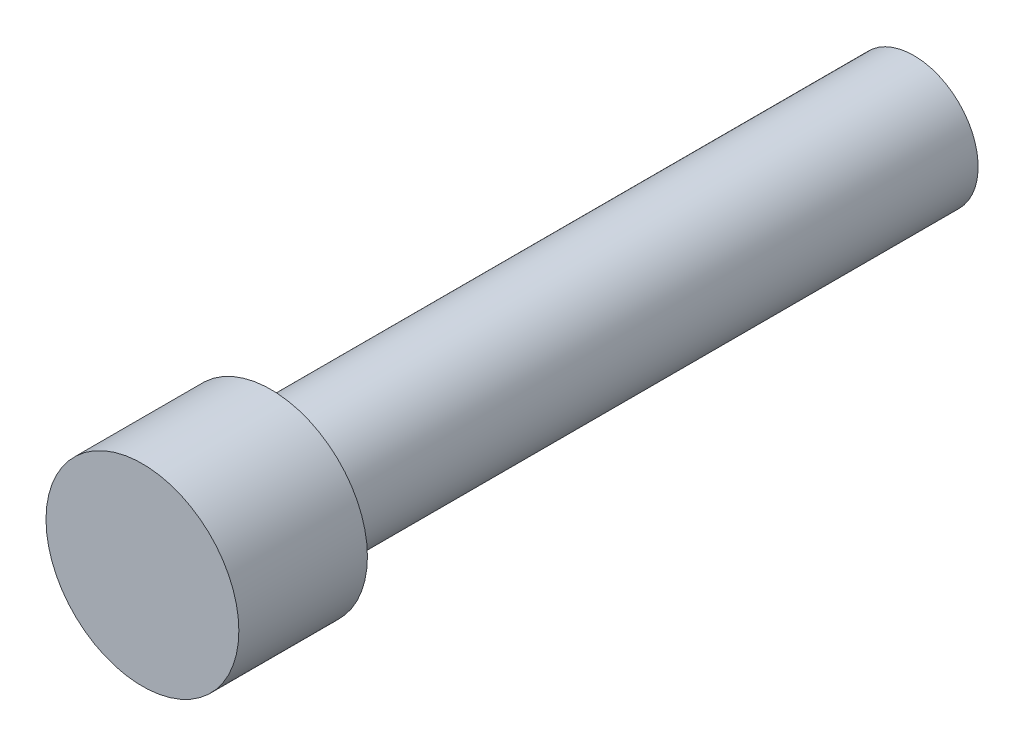
ISO-10303-21;
HEADER;
FILE_DESCRIPTION(('STEP AP214'),'2;1');
FILE_NAME('part.step','',(''),(''),'','','');
FILE_SCHEMA(('AUTOMOTIVE_DESIGN { 1 0 10303 214 1 1 1 1 }'));
ENDSEC;
DATA;
#1=APPLICATION_CONTEXT('core data for automotive mechanical design processes');
#2=APPLICATION_PROTOCOL_DEFINITION('international standard','automotive_design',2000,#1);
#3=PRODUCT_CONTEXT('',#1,'mechanical');
#4=PRODUCT('Part','Part','',(#3));
#5=PRODUCT_RELATED_PRODUCT_CATEGORY('part','',(#4));
#6=PRODUCT_DEFINITION_FORMATION('','',#4);
#7=PRODUCT_DEFINITION_CONTEXT('part definition',#1,'design');
#8=PRODUCT_DEFINITION('design','',#6,#7);
#9=PRODUCT_DEFINITION_SHAPE('','',#8);
#10=(LENGTH_UNIT() NAMED_UNIT(*) SI_UNIT(.MILLI.,.METRE.));
#11=(NAMED_UNIT(*) PLANE_ANGLE_UNIT() SI_UNIT($,.RADIAN.));
#12=(NAMED_UNIT(*) SI_UNIT($,.STERADIAN.) SOLID_ANGLE_UNIT());
#13=UNCERTAINTY_MEASURE_WITH_UNIT(LENGTH_MEASURE(1.E-05),#10,'distance_accuracy_value','');
#14=(GEOMETRIC_REPRESENTATION_CONTEXT(3) GLOBAL_UNCERTAINTY_ASSIGNED_CONTEXT((#13)) GLOBAL_UNIT_ASSIGNED_CONTEXT((#10,
#11,#12)) REPRESENTATION_CONTEXT('',''));
#15=CARTESIAN_POINT('',(0.,0.,0.));
#16=DIRECTION('',(0.,0.,1.));
#17=DIRECTION('',(1.,0.,0.));
#18=AXIS2_PLACEMENT_3D('',#15,#16,#17);
#19=CARTESIAN_POINT('',(0.,0.,2.));
#20=DIRECTION('',(0.,0.,-1.));
#21=DIRECTION('',(-1.,0.,0.));
#22=AXIS2_PLACEMENT_3D('',#19,#20,#21);
#23=CYLINDRICAL_SURFACE('',#22,1.5);
#24=CARTESIAN_POINT('',(0.,0.,2.));
#25=DIRECTION('',(0.,0.,1.));
#26=DIRECTION('',(1.,0.,0.));
#27=AXIS2_PLACEMENT_3D('',#24,#25,#26);
#28=CIRCLE('',#27,1.5);
#29=CARTESIAN_POINT('',(1.5,0.,2.));
#30=VERTEX_POINT('',#29);
#31=EDGE_CURVE('E45',#30,#30,#28,.T.);
#32=ORIENTED_EDGE('',*,*,#31,.F.);
#33=EDGE_LOOP('',(#32));
#34=FACE_BOUND('',#33,.T.);
#35=CARTESIAN_POINT('',(0.,0.,0.));
#36=DIRECTION('',(0.,0.,1.));
#37=DIRECTION('',(1.,0.,0.));
#38=AXIS2_PLACEMENT_3D('',#35,#36,#37);
#39=CIRCLE('',#38,1.5);
#40=CARTESIAN_POINT('',(1.5,0.,0.));
#41=VERTEX_POINT('',#40);
#42=EDGE_CURVE('E40',#41,#41,#39,.T.);
#43=ORIENTED_EDGE('',*,*,#42,.T.);
#44=EDGE_LOOP('',(#43));
#45=FACE_BOUND('',#44,.T.);
#46=ADVANCED_FACE('F37',(#34,#45),#23,.T.);
#47=CARTESIAN_POINT('',(0.,0.,2.));
#48=DIRECTION('',(0.,0.,1.));
#49=DIRECTION('',(1.,0.,0.));
#50=AXIS2_PLACEMENT_3D('',#47,#48,#49);
#51=PLANE('',#50);
#52=ORIENTED_EDGE('',*,*,#31,.T.);
#53=EDGE_LOOP('',(#52));
#54=FACE_BOUND('',#53,.T.);
#55=ADVANCED_FACE('F65',(#54),#51,.T.);
#56=CARTESIAN_POINT('',(0.,0.,0.));
#57=DIRECTION('',(0.,0.,1.));
#58=DIRECTION('',(1.,0.,0.));
#59=AXIS2_PLACEMENT_3D('',#56,#57,#58);
#60=PLANE('',#59);
#61=CARTESIAN_POINT('',(0.,0.,0.));
#62=DIRECTION('',(0.,0.,-1.));
#63=DIRECTION('',(-1.,0.,0.));
#64=AXIS2_PLACEMENT_3D('',#61,#62,#63);
#65=CIRCLE('',#64,1.);
#66=CARTESIAN_POINT('',(-1.,0.,0.));
#67=VERTEX_POINT('',#66);
#68=EDGE_CURVE('E10',#67,#67,#65,.T.);
#69=ORIENTED_EDGE('',*,*,#68,.F.);
#70=EDGE_LOOP('',(#69));
#71=FACE_BOUND('',#70,.T.);
#72=ORIENTED_EDGE('',*,*,#42,.F.);
#73=EDGE_LOOP('',(#72));
#74=FACE_BOUND('',#73,.T.);
#75=ADVANCED_FACE('F62',(#71,#74),#60,.F.);
#76=CARTESIAN_POINT('',(0.,0.,-10.));
#77=DIRECTION('',(0.,0.,1.));
#78=DIRECTION('',(1.,0.,0.));
#79=AXIS2_PLACEMENT_3D('',#76,#77,#78);
#80=CYLINDRICAL_SURFACE('',#79,1.);
#81=CARTESIAN_POINT('',(0.,0.,-10.));
#82=DIRECTION('',(0.,0.,-1.));
#83=DIRECTION('',(-1.,0.,0.));
#84=AXIS2_PLACEMENT_3D('',#81,#82,#83);
#85=CIRCLE('',#84,1.);
#86=CARTESIAN_POINT('',(-1.,0.,-10.));
#87=VERTEX_POINT('',#86);
#88=EDGE_CURVE('E52',#87,#87,#85,.T.);
#89=ORIENTED_EDGE('',*,*,#88,.F.);
#90=EDGE_LOOP('',(#89));
#91=FACE_BOUND('',#90,.T.);
#92=ORIENTED_EDGE('',*,*,#68,.T.);
#93=EDGE_LOOP('',(#92));
#94=FACE_BOUND('',#93,.T.);
#95=ADVANCED_FACE('F64',(#91,#94),#80,.T.);
#96=CARTESIAN_POINT('',(0.,0.,-10.));
#97=DIRECTION('',(0.,0.,-1.));
#98=DIRECTION('',(-1.,0.,0.));
#99=AXIS2_PLACEMENT_3D('',#96,#97,#98);
#100=PLANE('',#99);
#101=ORIENTED_EDGE('',*,*,#88,.T.);
#102=EDGE_LOOP('',(#101));
#103=FACE_BOUND('',#102,.T.);
#104=ADVANCED_FACE('F71',(#103),#100,.T.);
#105=CLOSED_SHELL('',(#46,#55,#75,#95,#104));
#106=MANIFOLD_SOLID_BREP('B2',#105);
#107=ADVANCED_BREP_SHAPE_REPRESENTATION('',(#18,#106),#14);
#108=SHAPE_DEFINITION_REPRESENTATION(#9,#107);
ENDSEC;
END-ISO-10303-21;
